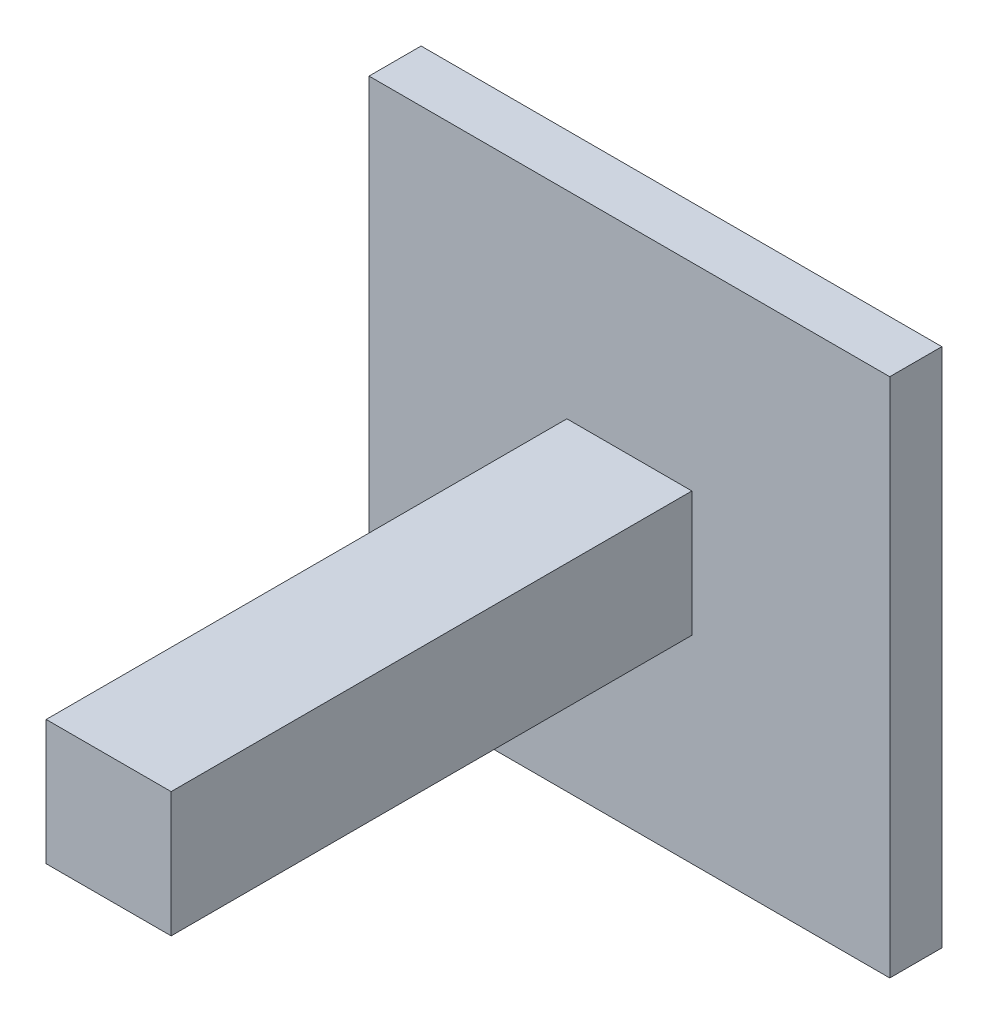
ISO-10303-21;
HEADER;
FILE_DESCRIPTION(('STEP AP214'),'2;1');
FILE_NAME('part.step','',(''),(''),'','','');
FILE_SCHEMA(('AUTOMOTIVE_DESIGN { 1 0 10303 214 1 1 1 1 }'));
ENDSEC;
DATA;
#1=APPLICATION_CONTEXT('core data for automotive mechanical design processes');
#2=APPLICATION_PROTOCOL_DEFINITION('international standard','automotive_design',2000,#1);
#3=PRODUCT_CONTEXT('',#1,'mechanical');
#4=PRODUCT('Part','Part','',(#3));
#5=PRODUCT_RELATED_PRODUCT_CATEGORY('part','',(#4));
#6=PRODUCT_DEFINITION_FORMATION('','',#4);
#7=PRODUCT_DEFINITION_CONTEXT('part definition',#1,'design');
#8=PRODUCT_DEFINITION('design','',#6,#7);
#9=PRODUCT_DEFINITION_SHAPE('','',#8);
#10=(LENGTH_UNIT() NAMED_UNIT(*) SI_UNIT(.MILLI.,.METRE.));
#11=(NAMED_UNIT(*) PLANE_ANGLE_UNIT() SI_UNIT($,.RADIAN.));
#12=(NAMED_UNIT(*) SI_UNIT($,.STERADIAN.) SOLID_ANGLE_UNIT());
#13=UNCERTAINTY_MEASURE_WITH_UNIT(LENGTH_MEASURE(1.E-05),#10,'distance_accuracy_value','');
#14=(GEOMETRIC_REPRESENTATION_CONTEXT(3) GLOBAL_UNCERTAINTY_ASSIGNED_CONTEXT((#13)) GLOBAL_UNIT_ASSIGNED_CONTEXT((#10,
#11,#12)) REPRESENTATION_CONTEXT('',''));
#15=CARTESIAN_POINT('',(0.,0.,0.));
#16=DIRECTION('',(0.,0.,1.));
#17=DIRECTION('',(1.,0.,0.));
#18=AXIS2_PLACEMENT_3D('',#15,#16,#17);
#19=CARTESIAN_POINT('',(25.,-25.,4.99999999999999));
#20=DIRECTION('',(0.,0.,1.));
#21=DIRECTION('',(1.,0.,0.));
#22=AXIS2_PLACEMENT_3D('',#19,#20,#21);
#23=PLANE('',#22);
#24=DIRECTION('',(0.,1.,0.));
#25=VECTOR('',#24,1.);
#26=CARTESIAN_POINT('',(25.,25.0000000000001,5.));
#27=LINE('',#26,#25);
#28=CARTESIAN_POINT('',(25.,-25.,4.99999999999999));
#29=VERTEX_POINT('',#28);
#30=CARTESIAN_POINT('',(25.,25.0000000000001,5.));
#31=VERTEX_POINT('',#30);
#32=EDGE_CURVE('E138',#29,#31,#27,.T.);
#33=ORIENTED_EDGE('',*,*,#32,.T.);
#34=DIRECTION('',(-1.,0.,0.));
#35=VECTOR('',#34,1.);
#36=CARTESIAN_POINT('',(-25.,25.,5.));
#37=LINE('',#36,#35);
#38=CARTESIAN_POINT('',(-25.,25.,5.));
#39=VERTEX_POINT('',#38);
#40=EDGE_CURVE('E83',#31,#39,#37,.T.);
#41=ORIENTED_EDGE('',*,*,#40,.T.);
#42=DIRECTION('',(0.,-1.,0.));
#43=VECTOR('',#42,1.);
#44=CARTESIAN_POINT('',(-25.,25.,5.));
#45=LINE('',#44,#43);
#46=CARTESIAN_POINT('',(-25.0000000000001,-25.,5.));
#47=VERTEX_POINT('',#46);
#48=EDGE_CURVE('E141',#39,#47,#45,.T.);
#49=ORIENTED_EDGE('',*,*,#48,.T.);
#50=DIRECTION('',(1.,0.,0.));
#51=VECTOR('',#50,1.);
#52=CARTESIAN_POINT('',(-25.0000000000001,-25.,5.));
#53=LINE('',#52,#51);
#54=EDGE_CURVE('E55',#47,#29,#53,.T.);
#55=ORIENTED_EDGE('',*,*,#54,.T.);
#56=EDGE_LOOP('',(#33,#41,#49,#55));
#57=FACE_BOUND('',#56,.T.);
#58=DIRECTION('',(-1.,0.,0.));
#59=VECTOR('',#58,1.);
#60=CARTESIAN_POINT('',(-5.99999999999998,5.99999999999999,5.));
#61=LINE('',#60,#59);
#62=CARTESIAN_POINT('',(6.00000000000001,6.00000000000001,5.));
#63=VERTEX_POINT('',#62);
#64=CARTESIAN_POINT('',(-5.99999999999998,5.99999999999999,5.));
#65=VERTEX_POINT('',#64);
#66=EDGE_CURVE('E239',#63,#65,#61,.T.);
#67=ORIENTED_EDGE('',*,*,#66,.F.);
#68=DIRECTION('',(0.,1.,0.));
#69=VECTOR('',#68,1.);
#70=CARTESIAN_POINT('',(6.00000000000001,6.00000000000001,5.));
#71=LINE('',#70,#69);
#72=CARTESIAN_POINT('',(5.99999999999999,-5.99999999999999,5.));
#73=VERTEX_POINT('',#72);
#74=EDGE_CURVE('E128',#73,#63,#71,.T.);
#75=ORIENTED_EDGE('',*,*,#74,.F.);
#76=DIRECTION('',(1.,0.,0.));
#77=VECTOR('',#76,1.);
#78=CARTESIAN_POINT('',(-6.,-6.00000000000002,5.));
#79=LINE('',#78,#77);
#80=CARTESIAN_POINT('',(-6.,-6.00000000000002,5.));
#81=VERTEX_POINT('',#80);
#82=EDGE_CURVE('E124',#81,#73,#79,.T.);
#83=ORIENTED_EDGE('',*,*,#82,.F.);
#84=DIRECTION('',(0.,-1.,0.));
#85=VECTOR('',#84,1.);
#86=CARTESIAN_POINT('',(-5.99999999999998,5.99999999999999,5.));
#87=LINE('',#86,#85);
#88=EDGE_CURVE('E236',#65,#81,#87,.T.);
#89=ORIENTED_EDGE('',*,*,#88,.F.);
#90=EDGE_LOOP('',(#67,#75,#83,#89));
#91=FACE_BOUND('',#90,.T.);
#92=ADVANCED_FACE('F31',(#57,#91),#23,.T.);
#93=CARTESIAN_POINT('',(25.,25.0000000000001,5.));
#94=DIRECTION('',(-1.,0.,0.));
#95=DIRECTION('',(0.,0.,1.));
#96=AXIS2_PLACEMENT_3D('',#93,#94,#95);
#97=PLANE('',#96);
#98=DIRECTION('',(0.,1.,0.));
#99=VECTOR('',#98,1.);
#100=CARTESIAN_POINT('',(25.0000000000001,25.0000000000001,0.));
#101=LINE('',#100,#99);
#102=CARTESIAN_POINT('',(25.,-25.,0.));
#103=VERTEX_POINT('',#102);
#104=CARTESIAN_POINT('',(25.0000000000001,25.0000000000001,0.));
#105=VERTEX_POINT('',#104);
#106=EDGE_CURVE('E130',#103,#105,#101,.T.);
#107=ORIENTED_EDGE('',*,*,#106,.T.);
#108=DIRECTION('',(0.,0.,-1.));
#109=VECTOR('',#108,1.);
#110=CARTESIAN_POINT('',(25.,25.0000000000001,5.));
#111=LINE('',#110,#109);
#112=EDGE_CURVE('E11',#31,#105,#111,.T.);
#113=ORIENTED_EDGE('',*,*,#112,.F.);
#114=ORIENTED_EDGE('',*,*,#32,.F.);
#115=DIRECTION('',(0.,0.,-1.));
#116=VECTOR('',#115,1.);
#117=CARTESIAN_POINT('',(25.,-25.,4.99999999999999));
#118=LINE('',#117,#116);
#119=EDGE_CURVE('E143',#29,#103,#118,.T.);
#120=ORIENTED_EDGE('',*,*,#119,.T.);
#121=EDGE_LOOP('',(#107,#113,#114,#120));
#122=FACE_BOUND('',#121,.T.);
#123=ADVANCED_FACE('F33',(#122),#97,.F.);
#124=CARTESIAN_POINT('',(-25.,25.,5.));
#125=DIRECTION('',(0.,-1.,0.));
#126=DIRECTION('',(0.,0.,-1.));
#127=AXIS2_PLACEMENT_3D('',#124,#125,#126);
#128=PLANE('',#127);
#129=DIRECTION('',(-1.,0.,0.));
#130=VECTOR('',#129,1.);
#131=CARTESIAN_POINT('',(-25.,25.,0.));
#132=LINE('',#131,#130);
#133=CARTESIAN_POINT('',(-25.,25.,0.));
#134=VERTEX_POINT('',#133);
#135=EDGE_CURVE('E133',#105,#134,#132,.T.);
#136=ORIENTED_EDGE('',*,*,#135,.T.);
#137=DIRECTION('',(0.,0.,-1.));
#138=VECTOR('',#137,1.);
#139=CARTESIAN_POINT('',(-25.,25.,5.));
#140=LINE('',#139,#138);
#141=EDGE_CURVE('E39',#39,#134,#140,.T.);
#142=ORIENTED_EDGE('',*,*,#141,.F.);
#143=ORIENTED_EDGE('',*,*,#40,.F.);
#144=ORIENTED_EDGE('',*,*,#112,.T.);
#145=EDGE_LOOP('',(#136,#142,#143,#144));
#146=FACE_BOUND('',#145,.T.);
#147=ADVANCED_FACE('F171',(#146),#128,.F.);
#148=CARTESIAN_POINT('',(-25.,25.,5.));
#149=DIRECTION('',(1.,0.,0.));
#150=DIRECTION('',(0.,0.,-1.));
#151=AXIS2_PLACEMENT_3D('',#148,#149,#150);
#152=PLANE('',#151);
#153=DIRECTION('',(0.,-1.,0.));
#154=VECTOR('',#153,1.);
#155=CARTESIAN_POINT('',(-25.,25.,0.));
#156=LINE('',#155,#154);
#157=CARTESIAN_POINT('',(-25.0000000000001,-25.0000000000001,0.));
#158=VERTEX_POINT('',#157);
#159=EDGE_CURVE('E146',#134,#158,#156,.T.);
#160=ORIENTED_EDGE('',*,*,#159,.T.);
#161=DIRECTION('',(0.,0.,-1.));
#162=VECTOR('',#161,1.);
#163=CARTESIAN_POINT('',(-25.0000000000001,-25.,5.));
#164=LINE('',#163,#162);
#165=EDGE_CURVE('E150',#47,#158,#164,.T.);
#166=ORIENTED_EDGE('',*,*,#165,.F.);
#167=ORIENTED_EDGE('',*,*,#48,.F.);
#168=ORIENTED_EDGE('',*,*,#141,.T.);
#169=EDGE_LOOP('',(#160,#166,#167,#168));
#170=FACE_BOUND('',#169,.T.);
#171=ADVANCED_FACE('F155',(#170),#152,.F.);
#172=CARTESIAN_POINT('',(-25.0000000000001,-25.,5.));
#173=DIRECTION('',(0.,1.,0.));
#174=DIRECTION('',(0.,0.,1.));
#175=AXIS2_PLACEMENT_3D('',#172,#173,#174);
#176=PLANE('',#175);
#177=DIRECTION('',(1.,0.,0.));
#178=VECTOR('',#177,1.);
#179=CARTESIAN_POINT('',(-25.0000000000001,-25.0000000000001,0.));
#180=LINE('',#179,#178);
#181=EDGE_CURVE('E76',#158,#103,#180,.T.);
#182=ORIENTED_EDGE('',*,*,#181,.T.);
#183=ORIENTED_EDGE('',*,*,#119,.F.);
#184=ORIENTED_EDGE('',*,*,#54,.F.);
#185=ORIENTED_EDGE('',*,*,#165,.T.);
#186=EDGE_LOOP('',(#182,#183,#184,#185));
#187=FACE_BOUND('',#186,.T.);
#188=ADVANCED_FACE('F163',(#187),#176,.F.);
#189=CARTESIAN_POINT('',(25.,-25.,0.));
#190=DIRECTION('',(0.,0.,1.));
#191=DIRECTION('',(1.,0.,0.));
#192=AXIS2_PLACEMENT_3D('',#189,#190,#191);
#193=PLANE('',#192);
#194=ORIENTED_EDGE('',*,*,#106,.F.);
#195=ORIENTED_EDGE('',*,*,#181,.F.);
#196=ORIENTED_EDGE('',*,*,#159,.F.);
#197=ORIENTED_EDGE('',*,*,#135,.F.);
#198=EDGE_LOOP('',(#194,#195,#196,#197));
#199=FACE_BOUND('',#198,.T.);
#200=ADVANCED_FACE('F159',(#199),#193,.F.);
#201=CARTESIAN_POINT('',(6.00000000000001,6.00000000000001,55.));
#202=DIRECTION('',(-1.,0.,0.));
#203=DIRECTION('',(0.,0.,1.));
#204=AXIS2_PLACEMENT_3D('',#201,#202,#203);
#205=PLANE('',#204);
#206=ORIENTED_EDGE('',*,*,#74,.T.);
#207=DIRECTION('',(0.,0.,-1.));
#208=VECTOR('',#207,1.);
#209=CARTESIAN_POINT('',(6.00000000000001,6.00000000000001,55.));
#210=LINE('',#209,#208);
#211=CARTESIAN_POINT('',(6.00000000000001,6.00000000000001,55.));
#212=VERTEX_POINT('',#211);
#213=EDGE_CURVE('E109',#212,#63,#210,.T.);
#214=ORIENTED_EDGE('',*,*,#213,.F.);
#215=DIRECTION('',(0.,1.,0.));
#216=VECTOR('',#215,1.);
#217=CARTESIAN_POINT('',(6.00000000000001,6.00000000000001,55.));
#218=LINE('',#217,#216);
#219=CARTESIAN_POINT('',(5.99999999999998,-5.99999999999999,55.));
#220=VERTEX_POINT('',#219);
#221=EDGE_CURVE('E116',#220,#212,#218,.T.);
#222=ORIENTED_EDGE('',*,*,#221,.F.);
#223=DIRECTION('',(0.,0.,-1.));
#224=VECTOR('',#223,1.);
#225=CARTESIAN_POINT('',(5.99999999999998,-5.99999999999999,55.));
#226=LINE('',#225,#224);
#227=EDGE_CURVE('E234',#220,#73,#226,.T.);
#228=ORIENTED_EDGE('',*,*,#227,.T.);
#229=EDGE_LOOP('',(#206,#214,#222,#228));
#230=FACE_BOUND('',#229,.T.);
#231=ADVANCED_FACE('F126',(#230),#205,.F.);
#232=CARTESIAN_POINT('',(-5.99999999999998,5.99999999999999,55.));
#233=DIRECTION('',(0.,-1.,0.));
#234=DIRECTION('',(1.,0.,0.));
#235=AXIS2_PLACEMENT_3D('',#232,#233,#234);
#236=PLANE('',#235);
#237=ORIENTED_EDGE('',*,*,#66,.T.);
#238=DIRECTION('',(0.,0.,-1.));
#239=VECTOR('',#238,1.);
#240=CARTESIAN_POINT('',(-5.99999999999998,5.99999999999999,55.));
#241=LINE('',#240,#239);
#242=CARTESIAN_POINT('',(-5.99999999999998,5.99999999999999,55.));
#243=VERTEX_POINT('',#242);
#244=EDGE_CURVE('E112',#243,#65,#241,.T.);
#245=ORIENTED_EDGE('',*,*,#244,.F.);
#246=DIRECTION('',(-1.,0.,0.));
#247=VECTOR('',#246,1.);
#248=CARTESIAN_POINT('',(-5.99999999999998,5.99999999999999,55.));
#249=LINE('',#248,#247);
#250=EDGE_CURVE('E105',#212,#243,#249,.T.);
#251=ORIENTED_EDGE('',*,*,#250,.F.);
#252=ORIENTED_EDGE('',*,*,#213,.T.);
#253=EDGE_LOOP('',(#237,#245,#251,#252));
#254=FACE_BOUND('',#253,.T.);
#255=ADVANCED_FACE('F107',(#254),#236,.F.);
#256=CARTESIAN_POINT('',(-5.99999999999998,5.99999999999999,55.));
#257=DIRECTION('',(1.,0.,0.));
#258=DIRECTION('',(0.,0.,-1.));
#259=AXIS2_PLACEMENT_3D('',#256,#257,#258);
#260=PLANE('',#259);
#261=ORIENTED_EDGE('',*,*,#88,.T.);
#262=DIRECTION('',(0.,0.,-1.));
#263=VECTOR('',#262,1.);
#264=CARTESIAN_POINT('',(-6.00000000000001,-6.00000000000002,55.));
#265=LINE('',#264,#263);
#266=CARTESIAN_POINT('',(-6.00000000000001,-6.00000000000002,55.));
#267=VERTEX_POINT('',#266);
#268=EDGE_CURVE('E46',#267,#81,#265,.T.);
#269=ORIENTED_EDGE('',*,*,#268,.F.);
#270=DIRECTION('',(0.,-1.,0.));
#271=VECTOR('',#270,1.);
#272=CARTESIAN_POINT('',(-5.99999999999998,5.99999999999999,55.));
#273=LINE('',#272,#271);
#274=EDGE_CURVE('E115',#243,#267,#273,.T.);
#275=ORIENTED_EDGE('',*,*,#274,.F.);
#276=ORIENTED_EDGE('',*,*,#244,.T.);
#277=EDGE_LOOP('',(#261,#269,#275,#276));
#278=FACE_BOUND('',#277,.T.);
#279=ADVANCED_FACE('F184',(#278),#260,.F.);
#280=CARTESIAN_POINT('',(-6.00000000000001,-6.00000000000002,55.));
#281=DIRECTION('',(0.,1.,0.));
#282=DIRECTION('',(-1.,0.,0.));
#283=AXIS2_PLACEMENT_3D('',#280,#281,#282);
#284=PLANE('',#283);
#285=ORIENTED_EDGE('',*,*,#82,.T.);
#286=ORIENTED_EDGE('',*,*,#227,.F.);
#287=DIRECTION('',(1.,0.,0.));
#288=VECTOR('',#287,1.);
#289=CARTESIAN_POINT('',(-6.00000000000001,-6.00000000000002,55.));
#290=LINE('',#289,#288);
#291=EDGE_CURVE('E120',#267,#220,#290,.T.);
#292=ORIENTED_EDGE('',*,*,#291,.F.);
#293=ORIENTED_EDGE('',*,*,#268,.T.);
#294=EDGE_LOOP('',(#285,#286,#292,#293));
#295=FACE_BOUND('',#294,.T.);
#296=ADVANCED_FACE('F187',(#295),#284,.F.);
#297=CARTESIAN_POINT('',(5.99999999999998,-5.99999999999999,55.));
#298=DIRECTION('',(0.,0.,1.));
#299=DIRECTION('',(1.,0.,0.));
#300=AXIS2_PLACEMENT_3D('',#297,#298,#299);
#301=PLANE('',#300);
#302=ORIENTED_EDGE('',*,*,#221,.T.);
#303=ORIENTED_EDGE('',*,*,#250,.T.);
#304=ORIENTED_EDGE('',*,*,#274,.T.);
#305=ORIENTED_EDGE('',*,*,#291,.T.);
#306=EDGE_LOOP('',(#302,#303,#304,#305));
#307=FACE_BOUND('',#306,.T.);
#308=ADVANCED_FACE('F119',(#307),#301,.T.);
#309=CLOSED_SHELL('',(#92,#123,#147,#171,#188,#200,#231,#255,#279,#296,#308));
#310=MANIFOLD_SOLID_BREP('B2',#309);
#311=ADVANCED_BREP_SHAPE_REPRESENTATION('',(#18,#310),#14);
#312=SHAPE_DEFINITION_REPRESENTATION(#9,#311);
ENDSEC;
END-ISO-10303-21;
